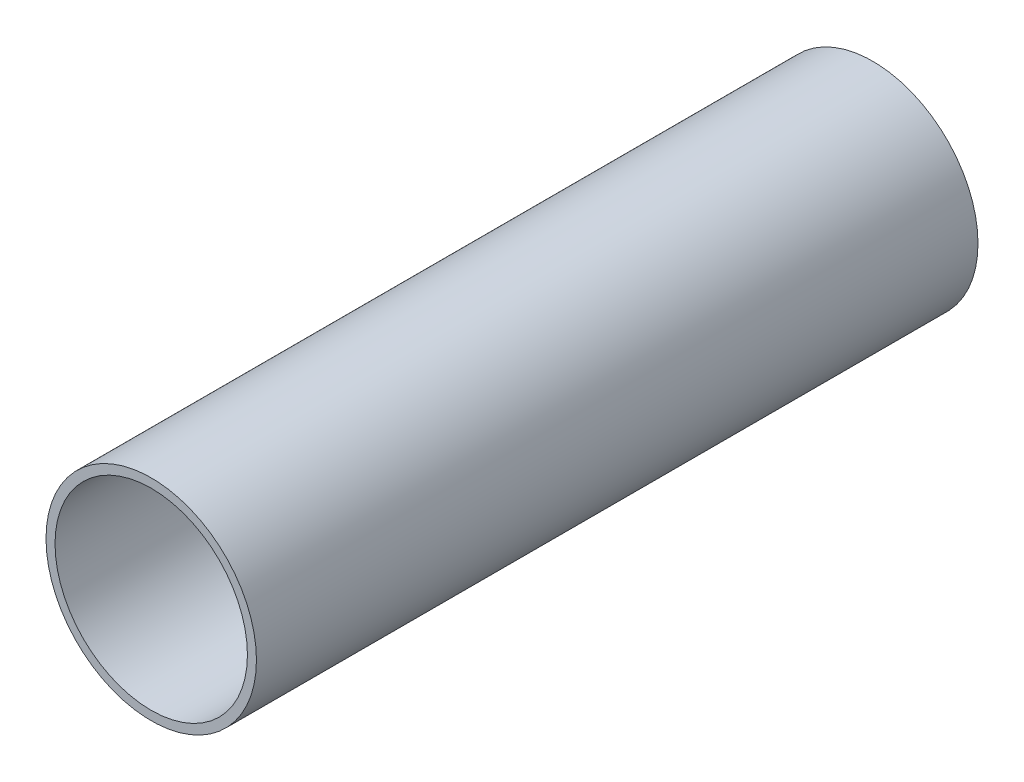
ISO-10303-21;
HEADER;
FILE_DESCRIPTION(('STEP AP214'),'2;1');
FILE_NAME('part.step','',(''),(''),'','','');
FILE_SCHEMA(('AUTOMOTIVE_DESIGN { 1 0 10303 214 1 1 1 1 }'));
ENDSEC;
DATA;
#1=APPLICATION_CONTEXT('core data for automotive mechanical design processes');
#2=APPLICATION_PROTOCOL_DEFINITION('international standard','automotive_design',2000,#1);
#3=PRODUCT_CONTEXT('',#1,'mechanical');
#4=PRODUCT('Part','Part','',(#3));
#5=PRODUCT_RELATED_PRODUCT_CATEGORY('part','',(#4));
#6=PRODUCT_DEFINITION_FORMATION('','',#4);
#7=PRODUCT_DEFINITION_CONTEXT('part definition',#1,'design');
#8=PRODUCT_DEFINITION('design','',#6,#7);
#9=PRODUCT_DEFINITION_SHAPE('','',#8);
#10=(LENGTH_UNIT() NAMED_UNIT(*) SI_UNIT(.MILLI.,.METRE.));
#11=(NAMED_UNIT(*) PLANE_ANGLE_UNIT() SI_UNIT($,.RADIAN.));
#12=(NAMED_UNIT(*) SI_UNIT($,.STERADIAN.) SOLID_ANGLE_UNIT());
#13=UNCERTAINTY_MEASURE_WITH_UNIT(LENGTH_MEASURE(1.E-05),#10,'distance_accuracy_value','');
#14=(GEOMETRIC_REPRESENTATION_CONTEXT(3) GLOBAL_UNCERTAINTY_ASSIGNED_CONTEXT((#13)) GLOBAL_UNIT_ASSIGNED_CONTEXT((#10,
#11,#12)) REPRESENTATION_CONTEXT('',''));
#15=CARTESIAN_POINT('',(0.,0.,0.));
#16=DIRECTION('',(0.,0.,1.));
#17=DIRECTION('',(1.,0.,0.));
#18=AXIS2_PLACEMENT_3D('',#15,#16,#17);
#19=CARTESIAN_POINT('',(0.,0.,60.));
#20=DIRECTION('',(0.,0.,1.));
#21=DIRECTION('',(1.,0.,0.));
#22=AXIS2_PLACEMENT_3D('',#19,#20,#21);
#23=PLANE('',#22);
#24=CARTESIAN_POINT('',(0.,0.,60.));
#25=DIRECTION('',(0.,0.,1.));
#26=DIRECTION('',(1.,0.,0.));
#27=AXIS2_PLACEMENT_3D('',#24,#25,#26);
#28=CIRCLE('',#27,8.75);
#29=CARTESIAN_POINT('',(8.75,0.,60.));
#30=VERTEX_POINT('',#29);
#31=EDGE_CURVE('E11',#30,#30,#28,.T.);
#32=ORIENTED_EDGE('',*,*,#31,.T.);
#33=EDGE_LOOP('',(#32));
#34=FACE_BOUND('',#33,.T.);
#35=CARTESIAN_POINT('',(0.,0.,60.));
#36=DIRECTION('',(0.,0.,1.));
#37=DIRECTION('',(1.,0.,0.));
#38=AXIS2_PLACEMENT_3D('',#35,#36,#37);
#39=CIRCLE('',#38,8.);
#40=CARTESIAN_POINT('',(8.,0.,60.));
#41=VERTEX_POINT('',#40);
#42=EDGE_CURVE('E49',#41,#41,#39,.T.);
#43=ORIENTED_EDGE('',*,*,#42,.F.);
#44=EDGE_LOOP('',(#43));
#45=FACE_BOUND('',#44,.T.);
#46=ADVANCED_FACE('F38',(#34,#45),#23,.T.);
#47=CARTESIAN_POINT('',(0.,0.,0.));
#48=DIRECTION('',(0.,0.,1.));
#49=DIRECTION('',(1.,0.,0.));
#50=AXIS2_PLACEMENT_3D('',#47,#48,#49);
#51=PLANE('',#50);
#52=CARTESIAN_POINT('',(0.,0.,0.));
#53=DIRECTION('',(0.,0.,1.));
#54=DIRECTION('',(1.,0.,0.));
#55=AXIS2_PLACEMENT_3D('',#52,#53,#54);
#56=CIRCLE('',#55,8.75);
#57=CARTESIAN_POINT('',(8.75,0.,0.));
#58=VERTEX_POINT('',#57);
#59=EDGE_CURVE('E42',#58,#58,#56,.T.);
#60=ORIENTED_EDGE('',*,*,#59,.F.);
#61=EDGE_LOOP('',(#60));
#62=FACE_BOUND('',#61,.T.);
#63=CARTESIAN_POINT('',(0.,0.,0.));
#64=DIRECTION('',(0.,0.,1.));
#65=DIRECTION('',(1.,0.,0.));
#66=AXIS2_PLACEMENT_3D('',#63,#64,#65);
#67=CIRCLE('',#66,8.);
#68=CARTESIAN_POINT('',(8.,0.,0.));
#69=VERTEX_POINT('',#68);
#70=EDGE_CURVE('E51',#69,#69,#67,.T.);
#71=ORIENTED_EDGE('',*,*,#70,.T.);
#72=EDGE_LOOP('',(#71));
#73=FACE_BOUND('',#72,.T.);
#74=ADVANCED_FACE('F61',(#62,#73),#51,.F.);
#75=CARTESIAN_POINT('',(0.,0.,60.));
#76=DIRECTION('',(0.,0.,-1.));
#77=DIRECTION('',(-1.,0.,0.));
#78=AXIS2_PLACEMENT_3D('',#75,#76,#77);
#79=CYLINDRICAL_SURFACE('',#78,8.75);
#80=ORIENTED_EDGE('',*,*,#31,.F.);
#81=EDGE_LOOP('',(#80));
#82=FACE_BOUND('',#81,.T.);
#83=ORIENTED_EDGE('',*,*,#59,.T.);
#84=EDGE_LOOP('',(#83));
#85=FACE_BOUND('',#84,.T.);
#86=ADVANCED_FACE('F40',(#82,#85),#79,.T.);
#87=CARTESIAN_POINT('',(0.,0.,60.));
#88=DIRECTION('',(0.,0.,-1.));
#89=DIRECTION('',(-1.,0.,0.));
#90=AXIS2_PLACEMENT_3D('',#87,#88,#89);
#91=CYLINDRICAL_SURFACE('',#90,8.);
#92=ORIENTED_EDGE('',*,*,#42,.T.);
#93=EDGE_LOOP('',(#92));
#94=FACE_BOUND('',#93,.T.);
#95=ORIENTED_EDGE('',*,*,#70,.F.);
#96=EDGE_LOOP('',(#95));
#97=FACE_BOUND('',#96,.T.);
#98=ADVANCED_FACE('F57',(#94,#97),#91,.F.);
#99=CLOSED_SHELL('',(#46,#74,#86,#98));
#100=MANIFOLD_SOLID_BREP('B2',#99);
#101=ADVANCED_BREP_SHAPE_REPRESENTATION('',(#18,#100),#14);
#102=SHAPE_DEFINITION_REPRESENTATION(#9,#101);
ENDSEC;
END-ISO-10303-21;
